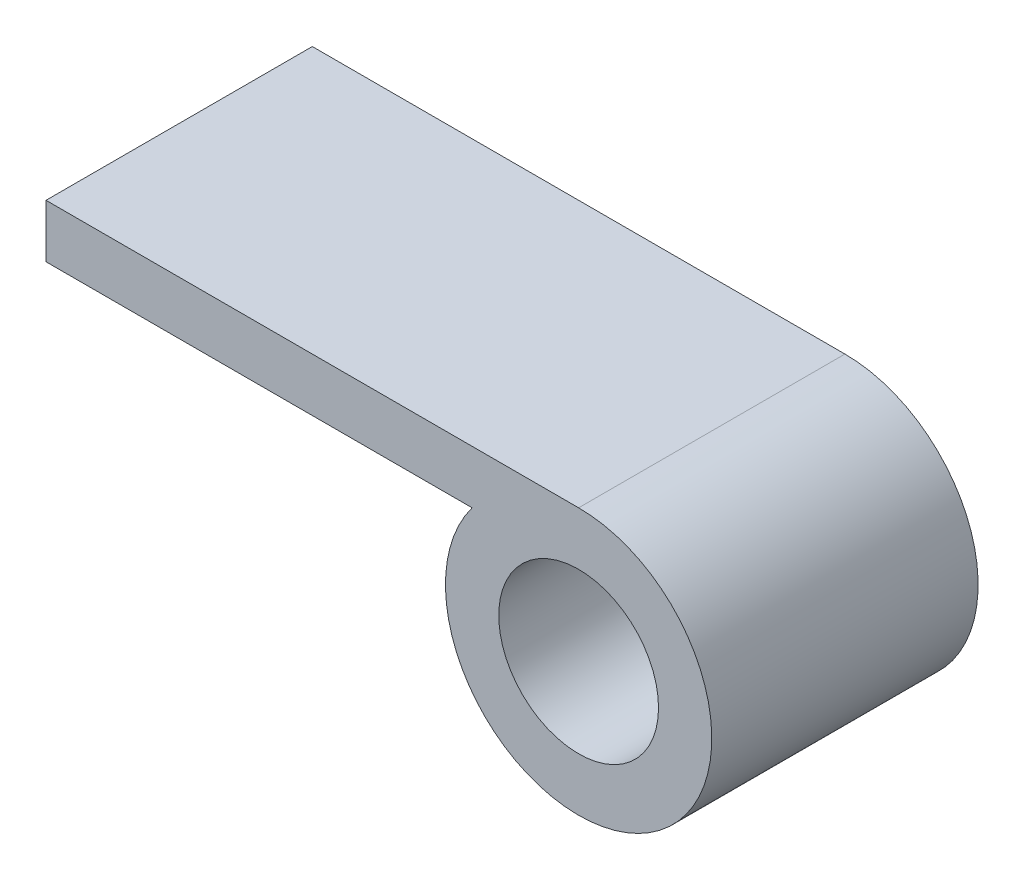
ISO-10303-21;
HEADER;
FILE_DESCRIPTION(('STEP AP214'),'2;1');
FILE_NAME('part.step','',(''),(''),'','','');
FILE_SCHEMA(('AUTOMOTIVE_DESIGN { 1 0 10303 214 1 1 1 1 }'));
ENDSEC;
DATA;
#1=APPLICATION_CONTEXT('core data for automotive mechanical design processes');
#2=APPLICATION_PROTOCOL_DEFINITION('international standard','automotive_design',2000,#1);
#3=PRODUCT_CONTEXT('',#1,'mechanical');
#4=PRODUCT('Part','Part','',(#3));
#5=PRODUCT_RELATED_PRODUCT_CATEGORY('part','',(#4));
#6=PRODUCT_DEFINITION_FORMATION('','',#4);
#7=PRODUCT_DEFINITION_CONTEXT('part definition',#1,'design');
#8=PRODUCT_DEFINITION('design','',#6,#7);
#9=PRODUCT_DEFINITION_SHAPE('','',#8);
#10=(LENGTH_UNIT() NAMED_UNIT(*) SI_UNIT(.MILLI.,.METRE.));
#11=(NAMED_UNIT(*) PLANE_ANGLE_UNIT() SI_UNIT($,.RADIAN.));
#12=(NAMED_UNIT(*) SI_UNIT($,.STERADIAN.) SOLID_ANGLE_UNIT());
#13=UNCERTAINTY_MEASURE_WITH_UNIT(LENGTH_MEASURE(1.E-05),#10,'distance_accuracy_value','');
#14=(GEOMETRIC_REPRESENTATION_CONTEXT(3) GLOBAL_UNCERTAINTY_ASSIGNED_CONTEXT((#13)) GLOBAL_UNIT_ASSIGNED_CONTEXT((#10,
#11,#12)) REPRESENTATION_CONTEXT('',''));
#15=CARTESIAN_POINT('',(0.,0.,0.));
#16=DIRECTION('',(0.,0.,1.));
#17=DIRECTION('',(1.,0.,0.));
#18=AXIS2_PLACEMENT_3D('',#15,#16,#17);
#19=CARTESIAN_POINT('',(0.,0.,10.));
#20=DIRECTION('',(0.,0.,1.));
#21=DIRECTION('',(1.,0.,0.));
#22=AXIS2_PLACEMENT_3D('',#19,#20,#21);
#23=PLANE('',#22);
#24=CARTESIAN_POINT('',(0.,0.,10.));
#25=DIRECTION('',(0.,0.,1.));
#26=DIRECTION('',(1.,0.,0.));
#27=AXIS2_PLACEMENT_3D('',#24,#25,#26);
#28=CIRCLE('',#27,5.);
#29=CARTESIAN_POINT('',(-4.,3.,10.));
#30=VERTEX_POINT('',#29);
#31=CARTESIAN_POINT('',(0.,5.,10.));
#32=VERTEX_POINT('',#31);
#33=EDGE_CURVE('E85',#30,#32,#28,.T.);
#34=ORIENTED_EDGE('',*,*,#33,.T.);
#35=DIRECTION('',(-1.,0.,0.));
#36=VECTOR('',#35,1.);
#37=CARTESIAN_POINT('',(0.,5.,10.));
#38=LINE('',#37,#36);
#39=CARTESIAN_POINT('',(-20.,5.,10.));
#40=VERTEX_POINT('',#39);
#41=EDGE_CURVE('E80',#32,#40,#38,.T.);
#42=ORIENTED_EDGE('',*,*,#41,.T.);
#43=DIRECTION('',(0.,-1.,0.));
#44=VECTOR('',#43,1.);
#45=CARTESIAN_POINT('',(-20.,5.,10.));
#46=LINE('',#45,#44);
#47=CARTESIAN_POINT('',(-20.,3.,10.));
#48=VERTEX_POINT('',#47);
#49=EDGE_CURVE('E83',#40,#48,#46,.T.);
#50=ORIENTED_EDGE('',*,*,#49,.T.);
#51=DIRECTION('',(1.,0.,0.));
#52=VECTOR('',#51,1.);
#53=CARTESIAN_POINT('',(-20.,3.,10.));
#54=LINE('',#53,#52);
#55=EDGE_CURVE('E50',#48,#30,#54,.T.);
#56=ORIENTED_EDGE('',*,*,#55,.T.);
#57=EDGE_LOOP('',(#34,#42,#50,#56));
#58=FACE_BOUND('',#57,.T.);
#59=CARTESIAN_POINT('',(0.,0.,10.));
#60=DIRECTION('',(0.,0.,1.));
#61=DIRECTION('',(1.,0.,0.));
#62=AXIS2_PLACEMENT_3D('',#59,#60,#61);
#63=CIRCLE('',#62,3.);
#64=CARTESIAN_POINT('',(3.,0.,10.));
#65=VERTEX_POINT('',#64);
#66=EDGE_CURVE('E100',#65,#65,#63,.T.);
#67=ORIENTED_EDGE('',*,*,#66,.F.);
#68=EDGE_LOOP('',(#67));
#69=FACE_BOUND('',#68,.T.);
#70=ADVANCED_FACE('F33',(#58,#69),#23,.T.);
#71=CARTESIAN_POINT('',(0.,0.,0.));
#72=DIRECTION('',(0.,0.,1.));
#73=DIRECTION('',(1.,0.,0.));
#74=AXIS2_PLACEMENT_3D('',#71,#72,#73);
#75=PLANE('',#74);
#76=CARTESIAN_POINT('',(0.,0.,0.));
#77=DIRECTION('',(0.,0.,1.));
#78=DIRECTION('',(1.,0.,0.));
#79=AXIS2_PLACEMENT_3D('',#76,#77,#78);
#80=CIRCLE('',#79,5.);
#81=CARTESIAN_POINT('',(-4.,3.,0.));
#82=VERTEX_POINT('',#81);
#83=CARTESIAN_POINT('',(0.,5.,0.));
#84=VERTEX_POINT('',#83);
#85=EDGE_CURVE('E97',#82,#84,#80,.T.);
#86=ORIENTED_EDGE('',*,*,#85,.F.);
#87=DIRECTION('',(1.,0.,0.));
#88=VECTOR('',#87,1.);
#89=CARTESIAN_POINT('',(-20.,3.,0.));
#90=LINE('',#89,#88);
#91=CARTESIAN_POINT('',(-20.,3.,0.));
#92=VERTEX_POINT('',#91);
#93=EDGE_CURVE('E73',#92,#82,#90,.T.);
#94=ORIENTED_EDGE('',*,*,#93,.F.);
#95=DIRECTION('',(0.,-1.,0.));
#96=VECTOR('',#95,1.);
#97=CARTESIAN_POINT('',(-20.,5.,0.));
#98=LINE('',#97,#96);
#99=CARTESIAN_POINT('',(-20.,5.,0.));
#100=VERTEX_POINT('',#99);
#101=EDGE_CURVE('E67',#100,#92,#98,.T.);
#102=ORIENTED_EDGE('',*,*,#101,.F.);
#103=DIRECTION('',(-1.,0.,0.));
#104=VECTOR('',#103,1.);
#105=CARTESIAN_POINT('',(0.,5.,0.));
#106=LINE('',#105,#104);
#107=EDGE_CURVE('E89',#84,#100,#106,.T.);
#108=ORIENTED_EDGE('',*,*,#107,.F.);
#109=EDGE_LOOP('',(#86,#94,#102,#108));
#110=FACE_BOUND('',#109,.T.);
#111=CARTESIAN_POINT('',(0.,0.,0.));
#112=DIRECTION('',(0.,0.,1.));
#113=DIRECTION('',(1.,0.,0.));
#114=AXIS2_PLACEMENT_3D('',#111,#112,#113);
#115=CIRCLE('',#114,3.);
#116=CARTESIAN_POINT('',(3.,0.,0.));
#117=VERTEX_POINT('',#116);
#118=EDGE_CURVE('E112',#117,#117,#115,.T.);
#119=ORIENTED_EDGE('',*,*,#118,.T.);
#120=EDGE_LOOP('',(#119));
#121=FACE_BOUND('',#120,.T.);
#122=ADVANCED_FACE('F108',(#110,#121),#75,.F.);
#123=CARTESIAN_POINT('',(0.,0.,10.));
#124=DIRECTION('',(0.,0.,-1.));
#125=DIRECTION('',(-1.,0.,0.));
#126=AXIS2_PLACEMENT_3D('',#123,#124,#125);
#127=CYLINDRICAL_SURFACE('',#126,5.);
#128=ORIENTED_EDGE('',*,*,#85,.T.);
#129=DIRECTION('',(0.,0.,-1.));
#130=VECTOR('',#129,1.);
#131=CARTESIAN_POINT('',(0.,5.,10.));
#132=LINE('',#131,#130);
#133=EDGE_CURVE('E11',#32,#84,#132,.T.);
#134=ORIENTED_EDGE('',*,*,#133,.F.);
#135=ORIENTED_EDGE('',*,*,#33,.F.);
#136=DIRECTION('',(0.,0.,-1.));
#137=VECTOR('',#136,1.);
#138=CARTESIAN_POINT('',(-4.,3.,10.));
#139=LINE('',#138,#137);
#140=EDGE_CURVE('E93',#30,#82,#139,.T.);
#141=ORIENTED_EDGE('',*,*,#140,.T.);
#142=EDGE_LOOP('',(#128,#134,#135,#141));
#143=FACE_BOUND('',#142,.T.);
#144=ADVANCED_FACE('F35',(#143),#127,.T.);
#145=CARTESIAN_POINT('',(0.,5.,10.));
#146=DIRECTION('',(0.,-1.,0.));
#147=DIRECTION('',(1.,0.,0.));
#148=AXIS2_PLACEMENT_3D('',#145,#146,#147);
#149=PLANE('',#148);
#150=ORIENTED_EDGE('',*,*,#107,.T.);
#151=DIRECTION('',(0.,0.,-1.));
#152=VECTOR('',#151,1.);
#153=CARTESIAN_POINT('',(-20.,5.,10.));
#154=LINE('',#153,#152);
#155=EDGE_CURVE('E42',#40,#100,#154,.T.);
#156=ORIENTED_EDGE('',*,*,#155,.F.);
#157=ORIENTED_EDGE('',*,*,#41,.F.);
#158=ORIENTED_EDGE('',*,*,#133,.T.);
#159=EDGE_LOOP('',(#150,#156,#157,#158));
#160=FACE_BOUND('',#159,.T.);
#161=ADVANCED_FACE('F88',(#160),#149,.F.);
#162=CARTESIAN_POINT('',(-20.,5.,10.));
#163=DIRECTION('',(1.,0.,0.));
#164=DIRECTION('',(0.,0.,-1.));
#165=AXIS2_PLACEMENT_3D('',#162,#163,#164);
#166=PLANE('',#165);
#167=ORIENTED_EDGE('',*,*,#101,.T.);
#168=DIRECTION('',(0.,0.,-1.));
#169=VECTOR('',#168,1.);
#170=CARTESIAN_POINT('',(-20.,3.,10.));
#171=LINE('',#170,#169);
#172=EDGE_CURVE('E90',#48,#92,#171,.T.);
#173=ORIENTED_EDGE('',*,*,#172,.F.);
#174=ORIENTED_EDGE('',*,*,#49,.F.);
#175=ORIENTED_EDGE('',*,*,#155,.T.);
#176=EDGE_LOOP('',(#167,#173,#174,#175));
#177=FACE_BOUND('',#176,.T.);
#178=ADVANCED_FACE('F91',(#177),#166,.F.);
#179=CARTESIAN_POINT('',(-20.,3.,10.));
#180=DIRECTION('',(0.,1.,0.));
#181=DIRECTION('',(0.,0.,1.));
#182=AXIS2_PLACEMENT_3D('',#179,#180,#181);
#183=PLANE('',#182);
#184=ORIENTED_EDGE('',*,*,#93,.T.);
#185=ORIENTED_EDGE('',*,*,#140,.F.);
#186=ORIENTED_EDGE('',*,*,#55,.F.);
#187=ORIENTED_EDGE('',*,*,#172,.T.);
#188=EDGE_LOOP('',(#184,#185,#186,#187));
#189=FACE_BOUND('',#188,.T.);
#190=ADVANCED_FACE('F105',(#189),#183,.F.);
#191=CARTESIAN_POINT('',(0.,0.,10.));
#192=DIRECTION('',(0.,0.,-1.));
#193=DIRECTION('',(-1.,0.,0.));
#194=AXIS2_PLACEMENT_3D('',#191,#192,#193);
#195=CYLINDRICAL_SURFACE('',#194,3.);
#196=ORIENTED_EDGE('',*,*,#66,.T.);
#197=EDGE_LOOP('',(#196));
#198=FACE_BOUND('',#197,.T.);
#199=ORIENTED_EDGE('',*,*,#118,.F.);
#200=EDGE_LOOP('',(#199));
#201=FACE_BOUND('',#200,.T.);
#202=ADVANCED_FACE('F118',(#198,#201),#195,.F.);
#203=CLOSED_SHELL('',(#70,#122,#144,#161,#178,#190,#202));
#204=MANIFOLD_SOLID_BREP('B2',#203);
#205=ADVANCED_BREP_SHAPE_REPRESENTATION('',(#18,#204),#14);
#206=SHAPE_DEFINITION_REPRESENTATION(#9,#205);
ENDSEC;
END-ISO-10303-21;
